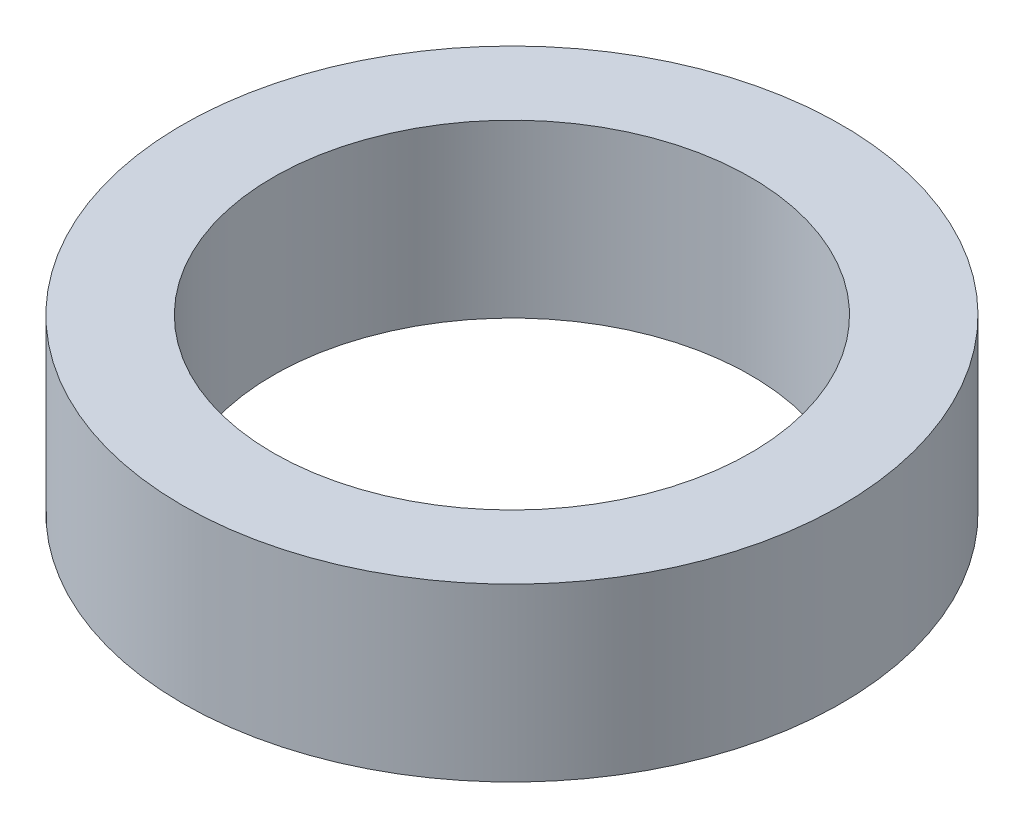
ISO-10303-21;
HEADER;
FILE_DESCRIPTION(('STEP AP214'),'2;1');
FILE_NAME('part.step','',(''),(''),'','','');
FILE_SCHEMA(('AUTOMOTIVE_DESIGN { 1 0 10303 214 1 1 1 1 }'));
ENDSEC;
DATA;
#1=APPLICATION_CONTEXT('core data for automotive mechanical design processes');
#2=APPLICATION_PROTOCOL_DEFINITION('international standard','automotive_design',2000,#1);
#3=PRODUCT_CONTEXT('',#1,'mechanical');
#4=PRODUCT('Part','Part','',(#3));
#5=PRODUCT_RELATED_PRODUCT_CATEGORY('part','',(#4));
#6=PRODUCT_DEFINITION_FORMATION('','',#4);
#7=PRODUCT_DEFINITION_CONTEXT('part definition',#1,'design');
#8=PRODUCT_DEFINITION('design','',#6,#7);
#9=PRODUCT_DEFINITION_SHAPE('','',#8);
#10=(LENGTH_UNIT() NAMED_UNIT(*) SI_UNIT(.MILLI.,.METRE.));
#11=(NAMED_UNIT(*) PLANE_ANGLE_UNIT() SI_UNIT($,.RADIAN.));
#12=(NAMED_UNIT(*) SI_UNIT($,.STERADIAN.) SOLID_ANGLE_UNIT());
#13=UNCERTAINTY_MEASURE_WITH_UNIT(LENGTH_MEASURE(1.E-05),#10,'distance_accuracy_value','');
#14=(GEOMETRIC_REPRESENTATION_CONTEXT(3) GLOBAL_UNCERTAINTY_ASSIGNED_CONTEXT((#13)) GLOBAL_UNIT_ASSIGNED_CONTEXT((#10,
#11,#12)) REPRESENTATION_CONTEXT('',''));
#15=CARTESIAN_POINT('',(0.,0.,0.));
#16=DIRECTION('',(0.,0.,1.));
#17=DIRECTION('',(1.,0.,0.));
#18=AXIS2_PLACEMENT_3D('',#15,#16,#17);
#19=CARTESIAN_POINT('',(0.,165.1,0.));
#20=DIRECTION('',(0.,-1.,0.));
#21=DIRECTION('',(0.,0.,-1.));
#22=AXIS2_PLACEMENT_3D('',#19,#20,#21);
#23=CYLINDRICAL_SURFACE('',#22,317.5);
#24=CARTESIAN_POINT('',(0.,165.1,0.));
#25=DIRECTION('',(0.,1.,0.));
#26=DIRECTION('',(0.,0.,1.));
#27=AXIS2_PLACEMENT_3D('',#24,#25,#26);
#28=CIRCLE('',#27,317.5);
#29=CARTESIAN_POINT('',(0.,165.1,317.5));
#30=VERTEX_POINT('',#29);
#31=EDGE_CURVE('E10',#30,#30,#28,.T.);
#32=ORIENTED_EDGE('',*,*,#31,.F.);
#33=EDGE_LOOP('',(#32));
#34=FACE_BOUND('',#33,.T.);
#35=CARTESIAN_POINT('',(0.,0.,0.));
#36=DIRECTION('',(0.,1.,0.));
#37=DIRECTION('',(0.,0.,1.));
#38=AXIS2_PLACEMENT_3D('',#35,#36,#37);
#39=CIRCLE('',#38,317.5);
#40=CARTESIAN_POINT('',(0.,0.,317.5));
#41=VERTEX_POINT('',#40);
#42=EDGE_CURVE('E44',#41,#41,#39,.T.);
#43=ORIENTED_EDGE('',*,*,#42,.T.);
#44=EDGE_LOOP('',(#43));
#45=FACE_BOUND('',#44,.T.);
#46=ADVANCED_FACE('F41',(#34,#45),#23,.T.);
#47=CARTESIAN_POINT('',(0.,165.1,0.));
#48=DIRECTION('',(0.,1.,0.));
#49=DIRECTION('',(0.,0.,1.));
#50=AXIS2_PLACEMENT_3D('',#47,#48,#49);
#51=PLANE('',#50);
#52=CARTESIAN_POINT('',(0.,165.1,0.));
#53=DIRECTION('',(0.,1.,0.));
#54=DIRECTION('',(0.,0.,1.));
#55=AXIS2_PLACEMENT_3D('',#52,#53,#54);
#56=CIRCLE('',#55,230.);
#57=CARTESIAN_POINT('',(0.,165.1,230.));
#58=VERTEX_POINT('',#57);
#59=EDGE_CURVE('E55',#58,#58,#56,.T.);
#60=ORIENTED_EDGE('',*,*,#59,.F.);
#61=EDGE_LOOP('',(#60));
#62=FACE_BOUND('',#61,.T.);
#63=ORIENTED_EDGE('',*,*,#31,.T.);
#64=EDGE_LOOP('',(#63));
#65=FACE_BOUND('',#64,.T.);
#66=ADVANCED_FACE('F72',(#62,#65),#51,.T.);
#67=CARTESIAN_POINT('',(0.,0.,0.));
#68=DIRECTION('',(0.,1.,0.));
#69=DIRECTION('',(0.,0.,1.));
#70=AXIS2_PLACEMENT_3D('',#67,#68,#69);
#71=PLANE('',#70);
#72=CARTESIAN_POINT('',(0.,0.,0.));
#73=DIRECTION('',(0.,1.,0.));
#74=DIRECTION('',(0.,0.,1.));
#75=AXIS2_PLACEMENT_3D('',#72,#73,#74);
#76=CIRCLE('',#75,230.);
#77=CARTESIAN_POINT('',(0.,0.,230.));
#78=VERTEX_POINT('',#77);
#79=EDGE_CURVE('E53',#78,#78,#76,.T.);
#80=ORIENTED_EDGE('',*,*,#79,.T.);
#81=EDGE_LOOP('',(#80));
#82=FACE_BOUND('',#81,.T.);
#83=ORIENTED_EDGE('',*,*,#42,.F.);
#84=EDGE_LOOP('',(#83));
#85=FACE_BOUND('',#84,.T.);
#86=ADVANCED_FACE('F63',(#82,#85),#71,.F.);
#87=CARTESIAN_POINT('',(0.,0.,0.));
#88=DIRECTION('',(0.,1.,0.));
#89=DIRECTION('',(0.,0.,1.));
#90=AXIS2_PLACEMENT_3D('',#87,#88,#89);
#91=CYLINDRICAL_SURFACE('',#90,230.);
#92=ORIENTED_EDGE('',*,*,#79,.F.);
#93=EDGE_LOOP('',(#92));
#94=FACE_BOUND('',#93,.T.);
#95=ORIENTED_EDGE('',*,*,#59,.T.);
#96=EDGE_LOOP('',(#95));
#97=FACE_BOUND('',#96,.T.);
#98=ADVANCED_FACE('F66',(#94,#97),#91,.F.);
#99=CLOSED_SHELL('',(#46,#66,#86,#98));
#100=MANIFOLD_SOLID_BREP('B2',#99);
#101=ADVANCED_BREP_SHAPE_REPRESENTATION('',(#18,#100),#14);
#102=SHAPE_DEFINITION_REPRESENTATION(#9,#101);
ENDSEC;
END-ISO-10303-21;
